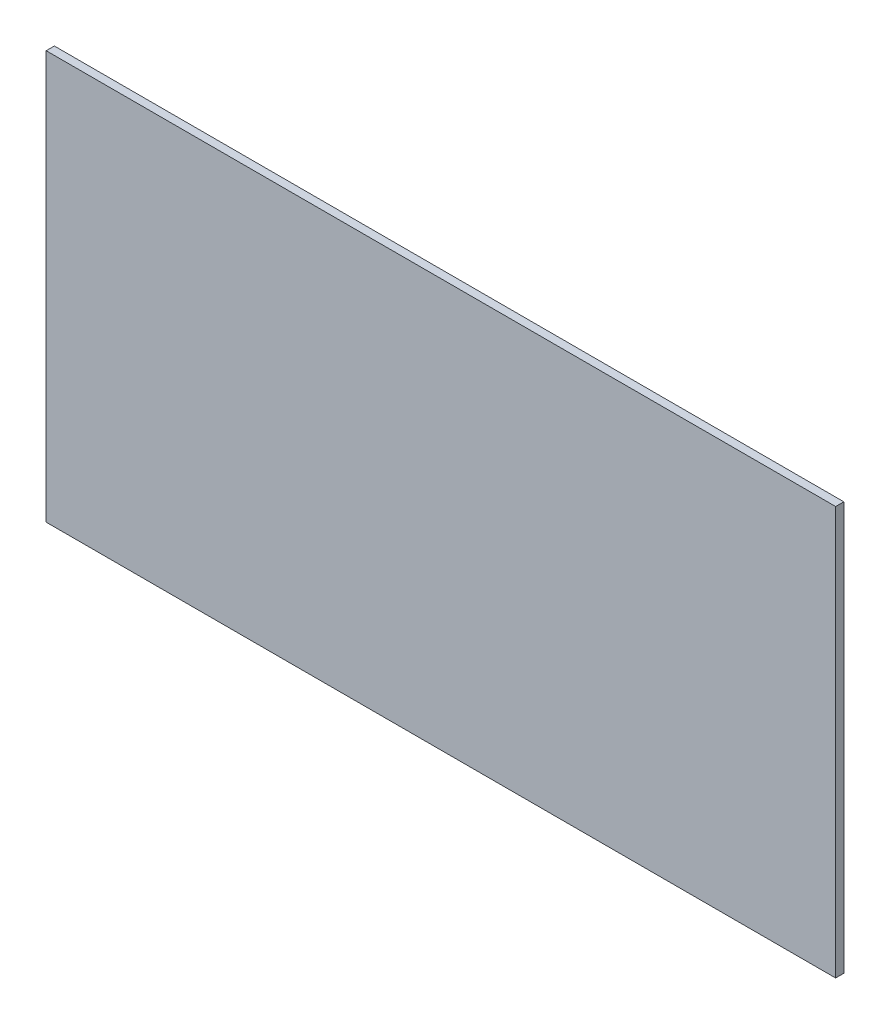
ISO-10303-21;
HEADER;
FILE_DESCRIPTION(('STEP AP214'),'2;1');
FILE_NAME('part.step','',(''),(''),'','','');
FILE_SCHEMA(('AUTOMOTIVE_DESIGN { 1 0 10303 214 1 1 1 1 }'));
ENDSEC;
DATA;
#1=APPLICATION_CONTEXT('core data for automotive mechanical design processes');
#2=APPLICATION_PROTOCOL_DEFINITION('international standard','automotive_design',2000,#1);
#3=PRODUCT_CONTEXT('',#1,'mechanical');
#4=PRODUCT('Part','Part','',(#3));
#5=PRODUCT_RELATED_PRODUCT_CATEGORY('part','',(#4));
#6=PRODUCT_DEFINITION_FORMATION('','',#4);
#7=PRODUCT_DEFINITION_CONTEXT('part definition',#1,'design');
#8=PRODUCT_DEFINITION('design','',#6,#7);
#9=PRODUCT_DEFINITION_SHAPE('','',#8);
#10=(LENGTH_UNIT() NAMED_UNIT(*) SI_UNIT(.MILLI.,.METRE.));
#11=(NAMED_UNIT(*) PLANE_ANGLE_UNIT() SI_UNIT($,.RADIAN.));
#12=(NAMED_UNIT(*) SI_UNIT($,.STERADIAN.) SOLID_ANGLE_UNIT());
#13=UNCERTAINTY_MEASURE_WITH_UNIT(LENGTH_MEASURE(1.E-05),#10,'distance_accuracy_value','');
#14=(GEOMETRIC_REPRESENTATION_CONTEXT(3) GLOBAL_UNCERTAINTY_ASSIGNED_CONTEXT((#13)) GLOBAL_UNIT_ASSIGNED_CONTEXT((#10,
#11,#12)) REPRESENTATION_CONTEXT('',''));
#15=CARTESIAN_POINT('',(0.,0.,0.));
#16=DIRECTION('',(0.,0.,1.));
#17=DIRECTION('',(1.,0.,0.));
#18=AXIS2_PLACEMENT_3D('',#15,#16,#17);
#19=CARTESIAN_POINT('',(0.,0.,3.));
#20=DIRECTION('',(1.,0.,0.));
#21=DIRECTION('',(0.,0.,-1.));
#22=AXIS2_PLACEMENT_3D('',#19,#20,#21);
#23=PLANE('',#22);
#24=DIRECTION('',(0.,-1.,0.));
#25=VECTOR('',#24,1.);
#26=CARTESIAN_POINT('',(0.,0.,0.));
#27=LINE('',#26,#25);
#28=CARTESIAN_POINT('',(0.,150.,0.));
#29=VERTEX_POINT('',#28);
#30=CARTESIAN_POINT('',(0.,0.,0.));
#31=VERTEX_POINT('',#30);
#32=EDGE_CURVE('E111',#29,#31,#27,.T.);
#33=ORIENTED_EDGE('',*,*,#32,.T.);
#34=DIRECTION('',(0.,0.,-1.));
#35=VECTOR('',#34,1.);
#36=CARTESIAN_POINT('',(0.,0.,3.));
#37=LINE('',#36,#35);
#38=CARTESIAN_POINT('',(0.,0.,3.));
#39=VERTEX_POINT('',#38);
#40=EDGE_CURVE('E11',#39,#31,#37,.T.);
#41=ORIENTED_EDGE('',*,*,#40,.F.);
#42=DIRECTION('',(0.,-1.,0.));
#43=VECTOR('',#42,1.);
#44=CARTESIAN_POINT('',(0.,0.,3.));
#45=LINE('',#44,#43);
#46=CARTESIAN_POINT('',(0.,150.,3.));
#47=VERTEX_POINT('',#46);
#48=EDGE_CURVE('E95',#47,#39,#45,.T.);
#49=ORIENTED_EDGE('',*,*,#48,.F.);
#50=DIRECTION('',(0.,0.,-1.));
#51=VECTOR('',#50,1.);
#52=CARTESIAN_POINT('',(0.,150.,3.));
#53=LINE('',#52,#51);
#54=EDGE_CURVE('E107',#47,#29,#53,.T.);
#55=ORIENTED_EDGE('',*,*,#54,.T.);
#56=EDGE_LOOP('',(#33,#41,#49,#55));
#57=FACE_BOUND('',#56,.T.);
#58=ADVANCED_FACE('F43',(#57),#23,.F.);
#59=CARTESIAN_POINT('',(0.,0.,3.));
#60=DIRECTION('',(0.,1.,0.));
#61=DIRECTION('',(0.,0.,1.));
#62=AXIS2_PLACEMENT_3D('',#59,#60,#61);
#63=PLANE('',#62);
#64=DIRECTION('',(1.,0.,0.));
#65=VECTOR('',#64,1.);
#66=CARTESIAN_POINT('',(0.,0.,0.));
#67=LINE('',#66,#65);
#68=CARTESIAN_POINT('',(290.,0.,0.));
#69=VERTEX_POINT('',#68);
#70=EDGE_CURVE('E100',#31,#69,#67,.T.);
#71=ORIENTED_EDGE('',*,*,#70,.T.);
#72=DIRECTION('',(0.,0.,-1.));
#73=VECTOR('',#72,1.);
#74=CARTESIAN_POINT('',(290.,0.,3.));
#75=LINE('',#74,#73);
#76=CARTESIAN_POINT('',(290.,0.,3.));
#77=VERTEX_POINT('',#76);
#78=EDGE_CURVE('E52',#77,#69,#75,.T.);
#79=ORIENTED_EDGE('',*,*,#78,.F.);
#80=DIRECTION('',(1.,0.,0.));
#81=VECTOR('',#80,1.);
#82=CARTESIAN_POINT('',(0.,0.,3.));
#83=LINE('',#82,#81);
#84=EDGE_CURVE('E90',#39,#77,#83,.T.);
#85=ORIENTED_EDGE('',*,*,#84,.F.);
#86=ORIENTED_EDGE('',*,*,#40,.T.);
#87=EDGE_LOOP('',(#71,#79,#85,#86));
#88=FACE_BOUND('',#87,.T.);
#89=ADVANCED_FACE('F99',(#88),#63,.F.);
#90=CARTESIAN_POINT('',(290.,0.,3.));
#91=DIRECTION('',(-1.,0.,0.));
#92=DIRECTION('',(0.,0.,1.));
#93=AXIS2_PLACEMENT_3D('',#90,#91,#92);
#94=PLANE('',#93);
#95=DIRECTION('',(0.,1.,0.));
#96=VECTOR('',#95,1.);
#97=CARTESIAN_POINT('',(290.,0.,0.));
#98=LINE('',#97,#96);
#99=CARTESIAN_POINT('',(290.,150.,0.));
#100=VERTEX_POINT('',#99);
#101=EDGE_CURVE('E77',#69,#100,#98,.T.);
#102=ORIENTED_EDGE('',*,*,#101,.T.);
#103=DIRECTION('',(0.,0.,-1.));
#104=VECTOR('',#103,1.);
#105=CARTESIAN_POINT('',(290.,150.,3.));
#106=LINE('',#105,#104);
#107=CARTESIAN_POINT('',(290.,150.,3.));
#108=VERTEX_POINT('',#107);
#109=EDGE_CURVE('E102',#108,#100,#106,.T.);
#110=ORIENTED_EDGE('',*,*,#109,.F.);
#111=DIRECTION('',(0.,1.,0.));
#112=VECTOR('',#111,1.);
#113=CARTESIAN_POINT('',(290.,0.,3.));
#114=LINE('',#113,#112);
#115=EDGE_CURVE('E93',#77,#108,#114,.T.);
#116=ORIENTED_EDGE('',*,*,#115,.F.);
#117=ORIENTED_EDGE('',*,*,#78,.T.);
#118=EDGE_LOOP('',(#102,#110,#116,#117));
#119=FACE_BOUND('',#118,.T.);
#120=ADVANCED_FACE('F103',(#119),#94,.F.);
#121=CARTESIAN_POINT('',(0.,150.,3.));
#122=DIRECTION('',(0.,-1.,0.));
#123=DIRECTION('',(0.,0.,-1.));
#124=AXIS2_PLACEMENT_3D('',#121,#122,#123);
#125=PLANE('',#124);
#126=DIRECTION('',(-1.,0.,0.));
#127=VECTOR('',#126,1.);
#128=CARTESIAN_POINT('',(0.,150.,0.));
#129=LINE('',#128,#127);
#130=EDGE_CURVE('E83',#100,#29,#129,.T.);
#131=ORIENTED_EDGE('',*,*,#130,.T.);
#132=ORIENTED_EDGE('',*,*,#54,.F.);
#133=DIRECTION('',(-1.,0.,0.));
#134=VECTOR('',#133,1.);
#135=CARTESIAN_POINT('',(0.,150.,3.));
#136=LINE('',#135,#134);
#137=EDGE_CURVE('E60',#108,#47,#136,.T.);
#138=ORIENTED_EDGE('',*,*,#137,.F.);
#139=ORIENTED_EDGE('',*,*,#109,.T.);
#140=EDGE_LOOP('',(#131,#132,#138,#139));
#141=FACE_BOUND('',#140,.T.);
#142=ADVANCED_FACE('F124',(#141),#125,.F.);
#143=CARTESIAN_POINT('',(0.,0.,3.));
#144=DIRECTION('',(0.,0.,-1.));
#145=DIRECTION('',(-1.,0.,0.));
#146=AXIS2_PLACEMENT_3D('',#143,#144,#145);
#147=PLANE('',#146);
#148=ORIENTED_EDGE('',*,*,#48,.T.);
#149=ORIENTED_EDGE('',*,*,#84,.T.);
#150=ORIENTED_EDGE('',*,*,#115,.T.);
#151=ORIENTED_EDGE('',*,*,#137,.T.);
#152=EDGE_LOOP('',(#148,#149,#150,#151));
#153=FACE_BOUND('',#152,.T.);
#154=ADVANCED_FACE('F91',(#153),#147,.F.);
#155=CARTESIAN_POINT('',(0.,0.,0.));
#156=DIRECTION('',(0.,0.,-1.));
#157=DIRECTION('',(-1.,0.,0.));
#158=AXIS2_PLACEMENT_3D('',#155,#156,#157);
#159=PLANE('',#158);
#160=ORIENTED_EDGE('',*,*,#32,.F.);
#161=ORIENTED_EDGE('',*,*,#130,.F.);
#162=ORIENTED_EDGE('',*,*,#101,.F.);
#163=ORIENTED_EDGE('',*,*,#70,.F.);
#164=EDGE_LOOP('',(#160,#161,#162,#163));
#165=FACE_BOUND('',#164,.T.);
#166=ADVANCED_FACE('F127',(#165),#159,.T.);
#167=CLOSED_SHELL('',(#58,#89,#120,#142,#154,#166));
#168=MANIFOLD_SOLID_BREP('B2',#167);
#169=ADVANCED_BREP_SHAPE_REPRESENTATION('',(#18,#168),#14);
#170=SHAPE_DEFINITION_REPRESENTATION(#9,#169);
ENDSEC;
END-ISO-10303-21;
